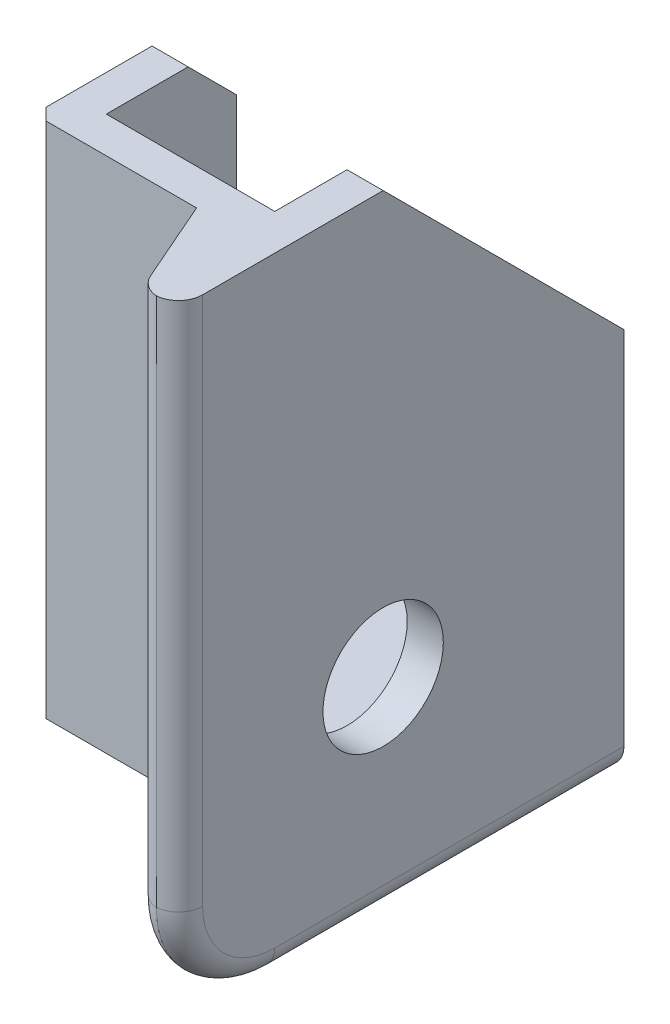
ISO-10303-21;
HEADER;
FILE_DESCRIPTION(('STEP AP214'),'2;1');
FILE_NAME('part.step','',(''),(''),'','','');
FILE_SCHEMA(('AUTOMOTIVE_DESIGN { 1 0 10303 214 1 1 1 1 }'));
ENDSEC;
DATA;
#1=APPLICATION_CONTEXT('core data for automotive mechanical design processes');
#2=APPLICATION_PROTOCOL_DEFINITION('international standard','automotive_design',2000,#1);
#3=PRODUCT_CONTEXT('',#1,'mechanical');
#4=PRODUCT('Part','Part','',(#3));
#5=PRODUCT_RELATED_PRODUCT_CATEGORY('part','',(#4));
#6=PRODUCT_DEFINITION_FORMATION('','',#4);
#7=PRODUCT_DEFINITION_CONTEXT('part definition',#1,'design');
#8=PRODUCT_DEFINITION('design','',#6,#7);
#9=PRODUCT_DEFINITION_SHAPE('','',#8);
#10=(LENGTH_UNIT() NAMED_UNIT(*) SI_UNIT(.MILLI.,.METRE.));
#11=(NAMED_UNIT(*) PLANE_ANGLE_UNIT() SI_UNIT($,.RADIAN.));
#12=(NAMED_UNIT(*) SI_UNIT($,.STERADIAN.) SOLID_ANGLE_UNIT());
#13=UNCERTAINTY_MEASURE_WITH_UNIT(LENGTH_MEASURE(1.E-05),#10,'distance_accuracy_value','');
#14=(GEOMETRIC_REPRESENTATION_CONTEXT(3) GLOBAL_UNCERTAINTY_ASSIGNED_CONTEXT((#13)) GLOBAL_UNIT_ASSIGNED_CONTEXT((#10,
#11,#12)) REPRESENTATION_CONTEXT('',''));
#15=CARTESIAN_POINT('',(0.,0.,0.));
#16=DIRECTION('',(0.,0.,1.));
#17=DIRECTION('',(1.,0.,0.));
#18=AXIS2_PLACEMENT_3D('',#15,#16,#17);
#19=CARTESIAN_POINT('',(0.,22.,0.));
#20=DIRECTION('',(0.,0.,1.));
#21=DIRECTION('',(-1.,0.,0.));
#22=AXIS2_PLACEMENT_3D('',#19,#20,#21);
#23=PLANE('',#22);
#24=DIRECTION('',(0.,1.,0.));
#25=VECTOR('',#24,1.);
#26=CARTESIAN_POINT('',(8.5,0.,0.));
#27=LINE('',#26,#25);
#28=CARTESIAN_POINT('',(8.5,1.5,0.));
#29=VERTEX_POINT('',#28);
#30=CARTESIAN_POINT('',(8.49999999999999,22.,0.));
#31=VERTEX_POINT('',#30);
#32=EDGE_CURVE('E223',#29,#31,#27,.T.);
#33=ORIENTED_EDGE('',*,*,#32,.F.);
#34=DIRECTION('',(1.,0.,0.));
#35=VECTOR('',#34,1.);
#36=CARTESIAN_POINT('',(0.,1.5,0.));
#37=LINE('',#36,#35);
#38=CARTESIAN_POINT('',(1.5,1.5,0.));
#39=VERTEX_POINT('',#38);
#40=EDGE_CURVE('E234',#39,#29,#37,.T.);
#41=ORIENTED_EDGE('',*,*,#40,.F.);
#42=DIRECTION('',(0.,-1.,0.));
#43=VECTOR('',#42,1.);
#44=CARTESIAN_POINT('',(1.5,0.,0.));
#45=LINE('',#44,#43);
#46=CARTESIAN_POINT('',(1.5,22.,0.));
#47=VERTEX_POINT('',#46);
#48=EDGE_CURVE('E225',#47,#39,#45,.T.);
#49=ORIENTED_EDGE('',*,*,#48,.F.);
#50=DIRECTION('',(1.,0.,0.));
#51=VECTOR('',#50,1.);
#52=CARTESIAN_POINT('',(0.,22.,0.));
#53=LINE('',#52,#51);
#54=EDGE_CURVE('E210',#47,#31,#53,.T.);
#55=ORIENTED_EDGE('',*,*,#54,.T.);
#56=EDGE_LOOP('',(#33,#41,#49,#55));
#57=FACE_BOUND('',#56,.T.);
#58=ADVANCED_FACE('F43',(#57),#23,.F.);
#59=CARTESIAN_POINT('',(0.,0.,-13.));
#60=DIRECTION('',(0.,-1.,0.));
#61=DIRECTION('',(0.,0.,1.));
#62=AXIS2_PLACEMENT_3D('',#59,#60,#61);
#63=PLANE('',#62);
#64=DIRECTION('',(0.,0.,1.));
#65=VECTOR('',#64,1.);
#66=CARTESIAN_POINT('',(0.50000000000001,0.,-13.));
#67=LINE('',#66,#65);
#68=CARTESIAN_POINT('',(0.50000000000001,0.,-13.));
#69=VERTEX_POINT('',#68);
#70=CARTESIAN_POINT('',(0.50000000000001,0.,0.999999999999992));
#71=VERTEX_POINT('',#70);
#72=EDGE_CURVE('E340',#69,#71,#67,.T.);
#73=ORIENTED_EDGE('',*,*,#72,.F.);
#74=DIRECTION('',(-1.,0.,0.));
#75=VECTOR('',#74,1.);
#76=CARTESIAN_POINT('',(0.,0.,-13.));
#77=LINE('',#76,#75);
#78=CARTESIAN_POINT('',(6.75,0.,-13.));
#79=VERTEX_POINT('',#78);
#80=EDGE_CURVE('E403',#79,#69,#77,.T.);
#81=ORIENTED_EDGE('',*,*,#80,.F.);
#82=DIRECTION('',(0.,0.,1.));
#83=VECTOR('',#82,1.);
#84=CARTESIAN_POINT('',(6.75,0.,-13.));
#85=LINE('',#84,#83);
#86=CARTESIAN_POINT('',(6.75,0.,0.999999999999989));
#87=VERTEX_POINT('',#86);
#88=EDGE_CURVE('E244',#79,#87,#85,.T.);
#89=ORIENTED_EDGE('',*,*,#88,.T.);
#90=DIRECTION('',(1.,0.,0.));
#91=VECTOR('',#90,1.);
#92=CARTESIAN_POINT('',(0.,0.,0.999999999999992));
#93=LINE('',#92,#91);
#94=EDGE_CURVE('E342',#71,#87,#93,.T.);
#95=ORIENTED_EDGE('',*,*,#94,.F.);
#96=EDGE_LOOP('',(#73,#81,#89,#95));
#97=FACE_BOUND('',#96,.T.);
#98=ADVANCED_FACE('F418',(#97),#63,.T.);
#99=CARTESIAN_POINT('',(9.99999999999999,0.,-13.));
#100=DIRECTION('',(1.,0.,0.));
#101=DIRECTION('',(0.,0.,1.));
#102=AXIS2_PLACEMENT_3D('',#99,#100,#101);
#103=PLANE('',#102);
#104=CARTESIAN_POINT('',(10.,4.5,-3.));
#105=DIRECTION('',(1.,0.,0.));
#106=DIRECTION('',(0.,0.,-1.));
#107=AXIS2_PLACEMENT_3D('',#104,#105,#106);
#108=CIRCLE('',#107,2.5);
#109=CARTESIAN_POINT('',(10.,4.5,-5.50000000000001));
#110=VERTEX_POINT('',#109);
#111=EDGE_CURVE('E469',#110,#110,#108,.T.);
#112=ORIENTED_EDGE('',*,*,#111,.F.);
#113=EDGE_LOOP('',(#112));
#114=FACE_BOUND('',#113,.T.);
#115=DIRECTION('',(0.,0.,1.));
#116=VECTOR('',#115,1.);
#117=CARTESIAN_POINT('',(10.,22.,0.));
#118=LINE('',#117,#116);
#119=CARTESIAN_POINT('',(10.,22.,-2.99999999999996));
#120=VERTEX_POINT('',#119);
#121=CARTESIAN_POINT('',(9.99999999999999,22.,4.5));
#122=VERTEX_POINT('',#121);
#123=EDGE_CURVE('E227',#120,#122,#118,.T.);
#124=ORIENTED_EDGE('',*,*,#123,.T.);
#125=DIRECTION('',(0.,-1.,0.));
#126=VECTOR('',#125,1.);
#127=CARTESIAN_POINT('',(9.99999999999999,22.,4.5));
#128=LINE('',#127,#126);
#129=CARTESIAN_POINT('',(9.99999999999999,0.,4.5));
#130=VERTEX_POINT('',#129);
#131=EDGE_CURVE('E273',#130,#122,#128,.F.);
#132=ORIENTED_EDGE('',*,*,#131,.F.);
#133=CARTESIAN_POINT('',(9.99999999999999,0.,1.5));
#134=DIRECTION('',(-1.,0.,0.));
#135=DIRECTION('',(0.,0.,1.));
#136=AXIS2_PLACEMENT_3D('',#133,#134,#135);
#137=CIRCLE('',#136,3.);
#138=CARTESIAN_POINT('',(9.99999999999999,-3.,1.5));
#139=VERTEX_POINT('',#138);
#140=EDGE_CURVE('E270',#139,#130,#137,.T.);
#141=ORIENTED_EDGE('',*,*,#140,.F.);
#142=DIRECTION('',(0.,0.,1.));
#143=VECTOR('',#142,1.);
#144=CARTESIAN_POINT('',(9.99999999999999,-3.,-13.));
#145=LINE('',#144,#143);
#146=CARTESIAN_POINT('',(9.99999999999999,-3.,-13.));
#147=VERTEX_POINT('',#146);
#148=EDGE_CURVE('E267',#147,#139,#145,.T.);
#149=ORIENTED_EDGE('',*,*,#148,.F.);
#150=DIRECTION('',(0.,-1.,0.));
#151=VECTOR('',#150,1.);
#152=CARTESIAN_POINT('',(9.99999999999999,0.,-13.));
#153=LINE('',#152,#151);
#154=CARTESIAN_POINT('',(9.99999999999999,12.,-13.));
#155=VERTEX_POINT('',#154);
#156=EDGE_CURVE('E243',#155,#147,#153,.T.);
#157=ORIENTED_EDGE('',*,*,#156,.F.);
#158=DIRECTION('',(0.,-0.707106781186546,-0.707106781186549));
#159=VECTOR('',#158,1.);
#160=CARTESIAN_POINT('',(9.99999999999999,6.00000000000001,-19.));
#161=LINE('',#160,#159);
#162=EDGE_CURVE('E307',#120,#155,#161,.T.);
#163=ORIENTED_EDGE('',*,*,#162,.F.);
#164=EDGE_LOOP('',(#124,#132,#141,#149,#157,#163));
#165=FACE_BOUND('',#164,.T.);
#166=ADVANCED_FACE('F444',(#114,#165),#103,.T.);
#167=CARTESIAN_POINT('',(8.5,0.,-13.));
#168=DIRECTION('',(-1.,0.,0.));
#169=DIRECTION('',(0.,-1.,0.));
#170=AXIS2_PLACEMENT_3D('',#167,#168,#169);
#171=PLANE('',#170);
#172=CARTESIAN_POINT('',(8.5,4.5,-3.));
#173=DIRECTION('',(1.,0.,0.));
#174=DIRECTION('',(0.,-1.,0.));
#175=AXIS2_PLACEMENT_3D('',#172,#173,#174);
#176=CIRCLE('',#175,2.5);
#177=CARTESIAN_POINT('',(8.49999999999999,4.5,-5.50000000000001));
#178=VERTEX_POINT('',#177);
#179=EDGE_CURVE('E364',#178,#178,#176,.T.);
#180=ORIENTED_EDGE('',*,*,#179,.T.);
#181=EDGE_LOOP('',(#180));
#182=FACE_BOUND('',#181,.T.);
#183=DIRECTION('',(0.,1.,0.));
#184=VECTOR('',#183,1.);
#185=CARTESIAN_POINT('',(8.5,0.,-13.));
#186=LINE('',#185,#184);
#187=CARTESIAN_POINT('',(8.5,1.5,-13.));
#188=VERTEX_POINT('',#187);
#189=CARTESIAN_POINT('',(8.49999999999999,12.,-13.));
#190=VERTEX_POINT('',#189);
#191=EDGE_CURVE('E394',#188,#190,#186,.T.);
#192=ORIENTED_EDGE('',*,*,#191,.F.);
#193=DIRECTION('',(0.,0.,1.));
#194=VECTOR('',#193,1.);
#195=CARTESIAN_POINT('',(8.5,1.5,-13.));
#196=LINE('',#195,#194);
#197=EDGE_CURVE('E232',#188,#29,#196,.T.);
#198=ORIENTED_EDGE('',*,*,#197,.T.);
#199=ORIENTED_EDGE('',*,*,#32,.T.);
#200=DIRECTION('',(0.,0.,1.));
#201=VECTOR('',#200,1.);
#202=CARTESIAN_POINT('',(8.49999999999999,22.,0.));
#203=LINE('',#202,#201);
#204=CARTESIAN_POINT('',(8.49999999999999,22.,-2.99999999999996));
#205=VERTEX_POINT('',#204);
#206=EDGE_CURVE('E206',#205,#31,#203,.T.);
#207=ORIENTED_EDGE('',*,*,#206,.F.);
#208=DIRECTION('',(0.,0.707106781186546,0.707106781186549));
#209=VECTOR('',#208,1.);
#210=CARTESIAN_POINT('',(8.5,6.00000000000001,-19.));
#211=LINE('',#210,#209);
#212=EDGE_CURVE('E304',#190,#205,#211,.T.);
#213=ORIENTED_EDGE('',*,*,#212,.F.);
#214=EDGE_LOOP('',(#192,#198,#199,#207,#213));
#215=FACE_BOUND('',#214,.T.);
#216=ADVANCED_FACE('F230',(#182,#215),#171,.T.);
#217=CARTESIAN_POINT('',(0.,1.5,-13.));
#218=DIRECTION('',(0.,1.,0.));
#219=DIRECTION('',(-1.,0.,0.));
#220=AXIS2_PLACEMENT_3D('',#217,#218,#219);
#221=PLANE('',#220);
#222=ORIENTED_EDGE('',*,*,#40,.T.);
#223=ORIENTED_EDGE('',*,*,#197,.F.);
#224=DIRECTION('',(1.,0.,0.));
#225=VECTOR('',#224,1.);
#226=CARTESIAN_POINT('',(0.,1.5,-13.));
#227=LINE('',#226,#225);
#228=CARTESIAN_POINT('',(1.5,1.5,-13.));
#229=VERTEX_POINT('',#228);
#230=EDGE_CURVE('E397',#229,#188,#227,.T.);
#231=ORIENTED_EDGE('',*,*,#230,.F.);
#232=DIRECTION('',(0.,0.,1.));
#233=VECTOR('',#232,1.);
#234=CARTESIAN_POINT('',(1.5,1.5,-13.));
#235=LINE('',#234,#233);
#236=EDGE_CURVE('E253',#229,#39,#235,.T.);
#237=ORIENTED_EDGE('',*,*,#236,.T.);
#238=EDGE_LOOP('',(#222,#223,#231,#237));
#239=FACE_BOUND('',#238,.T.);
#240=ADVANCED_FACE('F436',(#239),#221,.T.);
#241=CARTESIAN_POINT('',(1.5,0.,-13.));
#242=DIRECTION('',(1.,0.,0.));
#243=DIRECTION('',(0.,1.,0.));
#244=AXIS2_PLACEMENT_3D('',#241,#242,#243);
#245=PLANE('',#244);
#246=CARTESIAN_POINT('',(1.5,4.5,-3.));
#247=DIRECTION('',(-1.,0.,0.));
#248=DIRECTION('',(0.,1.,0.));
#249=AXIS2_PLACEMENT_3D('',#246,#247,#248);
#250=CIRCLE('',#249,2.5);
#251=CARTESIAN_POINT('',(1.5,4.5,-5.50000000000001));
#252=VERTEX_POINT('',#251);
#253=EDGE_CURVE('E466',#252,#252,#250,.T.);
#254=ORIENTED_EDGE('',*,*,#253,.T.);
#255=EDGE_LOOP('',(#254));
#256=FACE_BOUND('',#255,.T.);
#257=DIRECTION('',(0.,0.,1.));
#258=VECTOR('',#257,1.);
#259=CARTESIAN_POINT('',(1.5,22.,-5.4));
#260=LINE('',#259,#258);
#261=CARTESIAN_POINT('',(1.5,22.,-3.39999999999999));
#262=VERTEX_POINT('',#261);
#263=EDGE_CURVE('E288',#262,#47,#260,.T.);
#264=ORIENTED_EDGE('',*,*,#263,.T.);
#265=ORIENTED_EDGE('',*,*,#48,.T.);
#266=ORIENTED_EDGE('',*,*,#236,.F.);
#267=DIRECTION('',(0.,-1.,0.));
#268=VECTOR('',#267,1.);
#269=CARTESIAN_POINT('',(1.5,0.,-13.));
#270=LINE('',#269,#268);
#271=CARTESIAN_POINT('',(1.5,4.9,-13.));
#272=VERTEX_POINT('',#271);
#273=EDGE_CURVE('E399',#272,#229,#270,.T.);
#274=ORIENTED_EDGE('',*,*,#273,.F.);
#275=DIRECTION('',(0.,0.707106781186549,0.707106781186546));
#276=VECTOR('',#275,1.);
#277=CARTESIAN_POINT('',(1.5,2.44999999999999,-15.45));
#278=LINE('',#277,#276);
#279=CARTESIAN_POINT('',(1.5,6.9,-11.));
#280=VERTEX_POINT('',#279);
#281=EDGE_CURVE('E321',#280,#272,#278,.F.);
#282=ORIENTED_EDGE('',*,*,#281,.F.);
#283=DIRECTION('',(0.,0.,1.));
#284=VECTOR('',#283,1.);
#285=CARTESIAN_POINT('',(1.5,6.9,-13.));
#286=LINE('',#285,#284);
#287=CARTESIAN_POINT('',(1.5,6.9,-7.39999999999999));
#288=VERTEX_POINT('',#287);
#289=EDGE_CURVE('E250',#280,#288,#286,.T.);
#290=ORIENTED_EDGE('',*,*,#289,.T.);
#291=DIRECTION('',(0.,0.707106781186551,0.707106781186544));
#292=VECTOR('',#291,1.);
#293=CARTESIAN_POINT('',(1.5,8.90000000000001,-5.4));
#294=LINE('',#293,#292);
#295=CARTESIAN_POINT('',(1.5,8.90000000000001,-5.4));
#296=VERTEX_POINT('',#295);
#297=EDGE_CURVE('E334',#296,#288,#294,.F.);
#298=ORIENTED_EDGE('',*,*,#297,.F.);
#299=DIRECTION('',(0.,1.,0.));
#300=VECTOR('',#299,1.);
#301=CARTESIAN_POINT('',(1.5,0.,-5.4));
#302=LINE('',#301,#300);
#303=CARTESIAN_POINT('',(1.5,20.,-5.4));
#304=VERTEX_POINT('',#303);
#305=EDGE_CURVE('E218',#296,#304,#302,.T.);
#306=ORIENTED_EDGE('',*,*,#305,.T.);
#307=DIRECTION('',(0.,-0.707106781186547,-0.707106781186548));
#308=VECTOR('',#307,1.);
#309=CARTESIAN_POINT('',(1.5,6.20000000000001,-19.2));
#310=LINE('',#309,#308);
#311=EDGE_CURVE('E324',#262,#304,#310,.T.);
#312=ORIENTED_EDGE('',*,*,#311,.F.);
#313=EDGE_LOOP('',(#264,#265,#266,#274,#282,#290,#298,#306,#312));
#314=FACE_BOUND('',#313,.T.);
#315=ADVANCED_FACE('F433',(#256,#314),#245,.T.);
#316=CARTESIAN_POINT('',(0.,6.9,-13.));
#317=DIRECTION('',(0.,1.,0.));
#318=DIRECTION('',(-1.,0.,0.));
#319=AXIS2_PLACEMENT_3D('',#316,#317,#318);
#320=PLANE('',#319);
#321=ORIENTED_EDGE('',*,*,#289,.F.);
#322=DIRECTION('',(1.,0.,0.));
#323=VECTOR('',#322,1.);
#324=CARTESIAN_POINT('',(0.,6.9,-11.));
#325=LINE('',#324,#323);
#326=CARTESIAN_POINT('',(0.,6.9,-11.));
#327=VERTEX_POINT('',#326);
#328=EDGE_CURVE('E327',#327,#280,#325,.T.);
#329=ORIENTED_EDGE('',*,*,#328,.F.);
#330=DIRECTION('',(0.,0.,1.));
#331=VECTOR('',#330,1.);
#332=CARTESIAN_POINT('',(0.,6.9,-13.));
#333=LINE('',#332,#331);
#334=CARTESIAN_POINT('',(0.,6.9,-7.39999999999999));
#335=VERTEX_POINT('',#334);
#336=EDGE_CURVE('E247',#327,#335,#333,.T.);
#337=ORIENTED_EDGE('',*,*,#336,.T.);
#338=DIRECTION('',(-1.,0.,0.));
#339=VECTOR('',#338,1.);
#340=CARTESIAN_POINT('',(0.,6.9,-7.39999999999999));
#341=LINE('',#340,#339);
#342=EDGE_CURVE('E329',#288,#335,#341,.T.);
#343=ORIENTED_EDGE('',*,*,#342,.F.);
#344=EDGE_LOOP('',(#321,#329,#337,#343));
#345=FACE_BOUND('',#344,.T.);
#346=ADVANCED_FACE('F506',(#345),#320,.T.);
#347=CARTESIAN_POINT('',(0.,0.,-13.));
#348=DIRECTION('',(-1.,0.,0.));
#349=DIRECTION('',(0.,0.,-1.));
#350=AXIS2_PLACEMENT_3D('',#347,#348,#349);
#351=PLANE('',#350);
#352=CARTESIAN_POINT('',(0.,4.5,-3.));
#353=DIRECTION('',(1.,0.,0.));
#354=DIRECTION('',(0.,0.,-1.));
#355=AXIS2_PLACEMENT_3D('',#352,#353,#354);
#356=CIRCLE('',#355,2.5);
#357=CARTESIAN_POINT('',(0.,4.5,-5.50000000000001));
#358=VERTEX_POINT('',#357);
#359=EDGE_CURVE('E470',#358,#358,#356,.T.);
#360=ORIENTED_EDGE('',*,*,#359,.T.);
#361=EDGE_LOOP('',(#360));
#362=FACE_BOUND('',#361,.T.);
#363=DIRECTION('',(0.,-1.,0.));
#364=VECTOR('',#363,1.);
#365=CARTESIAN_POINT('',(0.,0.,0.999999999999992));
#366=LINE('',#365,#364);
#367=CARTESIAN_POINT('',(0.,22.,0.999999999999992));
#368=VERTEX_POINT('',#367);
#369=CARTESIAN_POINT('',(0.,0.500000000000007,0.999999999999992));
#370=VERTEX_POINT('',#369);
#371=EDGE_CURVE('E351',#368,#370,#366,.T.);
#372=ORIENTED_EDGE('',*,*,#371,.F.);
#373=DIRECTION('',(0.,0.,1.));
#374=VECTOR('',#373,1.);
#375=CARTESIAN_POINT('',(0.,22.,0.));
#376=LINE('',#375,#374);
#377=CARTESIAN_POINT('',(0.,22.,-3.39999999999999));
#378=VERTEX_POINT('',#377);
#379=EDGE_CURVE('E381',#378,#368,#376,.T.);
#380=ORIENTED_EDGE('',*,*,#379,.F.);
#381=DIRECTION('',(0.,0.707106781186547,0.707106781186548));
#382=VECTOR('',#381,1.);
#383=CARTESIAN_POINT('',(0.,6.20000000000001,-19.2));
#384=LINE('',#383,#382);
#385=CARTESIAN_POINT('',(0.,20.,-5.4));
#386=VERTEX_POINT('',#385);
#387=EDGE_CURVE('E316',#386,#378,#384,.T.);
#388=ORIENTED_EDGE('',*,*,#387,.F.);
#389=DIRECTION('',(0.,-1.,0.));
#390=VECTOR('',#389,1.);
#391=CARTESIAN_POINT('',(0.,0.,-5.4));
#392=LINE('',#391,#390);
#393=CARTESIAN_POINT('',(0.,8.90000000000001,-5.4));
#394=VERTEX_POINT('',#393);
#395=EDGE_CURVE('E459',#386,#394,#392,.T.);
#396=ORIENTED_EDGE('',*,*,#395,.T.);
#397=DIRECTION('',(0.,-0.707106781186551,-0.707106781186544));
#398=VECTOR('',#397,1.);
#399=CARTESIAN_POINT('',(0.,8.90000000000001,-5.4));
#400=LINE('',#399,#398);
#401=EDGE_CURVE('E337',#335,#394,#400,.F.);
#402=ORIENTED_EDGE('',*,*,#401,.F.);
#403=ORIENTED_EDGE('',*,*,#336,.F.);
#404=DIRECTION('',(0.,-0.707106781186549,-0.707106781186546));
#405=VECTOR('',#404,1.);
#406=CARTESIAN_POINT('',(0.,2.44999999999999,-15.45));
#407=LINE('',#406,#405);
#408=CARTESIAN_POINT('',(0.,4.9,-13.));
#409=VERTEX_POINT('',#408);
#410=EDGE_CURVE('E314',#409,#327,#407,.F.);
#411=ORIENTED_EDGE('',*,*,#410,.F.);
#412=DIRECTION('',(0.,1.,0.));
#413=VECTOR('',#412,1.);
#414=CARTESIAN_POINT('',(0.,0.,-13.));
#415=LINE('',#414,#413);
#416=CARTESIAN_POINT('',(0.,0.500000000000007,-13.));
#417=VERTEX_POINT('',#416);
#418=EDGE_CURVE('E401',#417,#409,#415,.T.);
#419=ORIENTED_EDGE('',*,*,#418,.F.);
#420=DIRECTION('',(0.,0.,-1.));
#421=VECTOR('',#420,1.);
#422=CARTESIAN_POINT('',(0.,0.500000000000007,-13.));
#423=LINE('',#422,#421);
#424=EDGE_CURVE('E354',#370,#417,#423,.T.);
#425=ORIENTED_EDGE('',*,*,#424,.F.);
#426=EDGE_LOOP('',(#372,#380,#388,#396,#402,#403,#411,#419,#425));
#427=FACE_BOUND('',#426,.T.);
#428=ADVANCED_FACE('F424',(#362,#427),#351,.T.);
#429=CARTESIAN_POINT('',(5.6655737704918,2.47868852459017,-13.));
#430=DIRECTION('',(-0.916157334902189,-0.400818834019708,0.));
#431=DIRECTION('',(0.400818834019708,-0.916157334902189,0.));
#432=AXIS2_PLACEMENT_3D('',#429,#430,#431);
#433=PLANE('',#432);
#434=DIRECTION('',(-0.400818834019709,0.916157334902189,0.));
#435=VECTOR('',#434,1.);
#436=CARTESIAN_POINT('',(8.5,-4.00000000000001,1.5));
#437=LINE('',#436,#435);
#438=CARTESIAN_POINT('',(8.23785823988363,-3.40081883401971,1.5));
#439=VERTEX_POINT('',#438);
#440=CARTESIAN_POINT('',(6.75,0.,1.5));
#441=VERTEX_POINT('',#440);
#442=EDGE_CURVE('E302',#439,#441,#437,.T.);
#443=ORIENTED_EDGE('',*,*,#442,.T.);
#444=DIRECTION('',(-0.295540231644525,0.675520529473199,-0.675520529473198));
#445=VECTOR('',#444,1.);
#446=CARTESIAN_POINT('',(3.26559714795008,7.96434937611408,-6.46434937611407));
#447=LINE('',#446,#445);
#448=CARTESIAN_POINT('',(6.640625,0.250000000000005,1.25));
#449=VERTEX_POINT('',#448);
#450=EDGE_CURVE('E11',#441,#449,#447,.T.);
#451=ORIENTED_EDGE('',*,*,#450,.T.);
#452=DIRECTION('',(0.295540231644526,-0.6755205294732,-0.675520529473196));
#453=VECTOR('',#452,1.);
#454=CARTESIAN_POINT('',(6.16042780748662,1.34759358288771,2.34759358288769));
#455=LINE('',#454,#453);
#456=EDGE_CURVE('E360',#87,#449,#455,.F.);
#457=ORIENTED_EDGE('',*,*,#456,.F.);
#458=ORIENTED_EDGE('',*,*,#88,.F.);
#459=DIRECTION('',(-0.400818834019708,0.916157334902189,0.));
#460=VECTOR('',#459,1.);
#461=CARTESIAN_POINT('',(5.6655737704918,2.47868852459017,-13.));
#462=LINE('',#461,#460);
#463=CARTESIAN_POINT('',(8.23785823988363,-3.40081883401971,-13.));
#464=VERTEX_POINT('',#463);
#465=EDGE_CURVE('E239',#464,#79,#462,.T.);
#466=ORIENTED_EDGE('',*,*,#465,.F.);
#467=DIRECTION('',(0.,0.,1.));
#468=VECTOR('',#467,1.);
#469=CARTESIAN_POINT('',(8.23785823988363,-3.40081883401971,-13.));
#470=LINE('',#469,#468);
#471=EDGE_CURVE('E276',#439,#464,#470,.F.);
#472=ORIENTED_EDGE('',*,*,#471,.F.);
#473=EDGE_LOOP('',(#443,#451,#457,#458,#466,#472));
#474=FACE_BOUND('',#473,.T.);
#475=ADVANCED_FACE('F415',(#474),#433,.T.);
#476=CARTESIAN_POINT('',(0.,0.,-13.));
#477=DIRECTION('',(0.,0.,-1.));
#478=DIRECTION('',(1.,0.,0.));
#479=AXIS2_PLACEMENT_3D('',#476,#477,#478);
#480=PLANE('',#479);
#481=ORIENTED_EDGE('',*,*,#418,.T.);
#482=DIRECTION('',(-1.,0.,0.));
#483=VECTOR('',#482,1.);
#484=CARTESIAN_POINT('',(0.,4.9,-13.));
#485=LINE('',#484,#483);
#486=EDGE_CURVE('E332',#272,#409,#485,.T.);
#487=ORIENTED_EDGE('',*,*,#486,.F.);
#488=ORIENTED_EDGE('',*,*,#273,.T.);
#489=ORIENTED_EDGE('',*,*,#230,.T.);
#490=ORIENTED_EDGE('',*,*,#191,.T.);
#491=DIRECTION('',(-1.,0.,0.));
#492=VECTOR('',#491,1.);
#493=CARTESIAN_POINT('',(8.49999999999999,12.,-13.));
#494=LINE('',#493,#492);
#495=EDGE_CURVE('E284',#155,#190,#494,.T.);
#496=ORIENTED_EDGE('',*,*,#495,.F.);
#497=ORIENTED_EDGE('',*,*,#156,.T.);
#498=CARTESIAN_POINT('',(8.99999999999999,-3.,-13.));
#499=DIRECTION('',(0.,0.,1.));
#500=DIRECTION('',(1.,0.,0.));
#501=AXIS2_PLACEMENT_3D('',#498,#499,#500);
#502=CIRCLE('',#501,1.);
#503=CARTESIAN_POINT('',(9.0770077873929,-3.99703049134962,-13.));
#504=VERTEX_POINT('',#503);
#505=EDGE_CURVE('E279',#504,#147,#502,.T.);
#506=ORIENTED_EDGE('',*,*,#505,.F.);
#507=CARTESIAN_POINT('',(9.15401557478581,-3.,-13.));
#508=DIRECTION('',(0.,0.,1.));
#509=DIRECTION('',(1.,0.,0.));
#510=AXIS2_PLACEMENT_3D('',#507,#508,#509);
#511=CIRCLE('',#510,1.);
#512=EDGE_CURVE('E281',#464,#504,#511,.T.);
#513=ORIENTED_EDGE('',*,*,#512,.F.);
#514=ORIENTED_EDGE('',*,*,#465,.T.);
#515=ORIENTED_EDGE('',*,*,#80,.T.);
#516=DIRECTION('',(-0.70710678118655,0.707106781186545,0.));
#517=VECTOR('',#516,1.);
#518=CARTESIAN_POINT('',(0.250000000000003,0.250000000000005,-13.));
#519=LINE('',#518,#517);
#520=EDGE_CURVE('E356',#417,#69,#519,.F.);
#521=ORIENTED_EDGE('',*,*,#520,.F.);
#522=EDGE_LOOP('',(#481,#487,#488,#489,#490,#496,#497,#506,#513,#514,#515,#521));
#523=FACE_BOUND('',#522,.T.);
#524=ADVANCED_FACE('F410',(#523),#480,.T.);
#525=CARTESIAN_POINT('',(5.11475409836065,22.,-2.23770491803279));
#526=DIRECTION('',(0.916157334902189,0.,-0.400818834019709));
#527=DIRECTION('',(0.400818834019709,0.,0.916157334902189));
#528=AXIS2_PLACEMENT_3D('',#525,#526,#527);
#529=PLANE('',#528);
#530=DIRECTION('',(-0.400818834019709,0.,-0.916157334902189));
#531=VECTOR('',#530,1.);
#532=CARTESIAN_POINT('',(5.11475409836065,22.,-2.23770491803279));
#533=LINE('',#532,#531);
#534=CARTESIAN_POINT('',(8.23785823988363,22.,4.90081883401971));
#535=VERTEX_POINT('',#534);
#536=CARTESIAN_POINT('',(6.75,22.,1.5));
#537=VERTEX_POINT('',#536);
#538=EDGE_CURVE('E380',#535,#537,#533,.T.);
#539=ORIENTED_EDGE('',*,*,#538,.T.);
#540=DIRECTION('',(0.,-1.,0.));
#541=VECTOR('',#540,1.);
#542=CARTESIAN_POINT('',(6.75,22.,1.5));
#543=LINE('',#542,#541);
#544=CARTESIAN_POINT('',(6.75,0.500000000000011,1.5));
#545=VERTEX_POINT('',#544);
#546=EDGE_CURVE('E226',#537,#545,#543,.T.);
#547=ORIENTED_EDGE('',*,*,#546,.T.);
#548=DIRECTION('',(-0.295540231644524,-0.675520529473201,-0.675520529473197));
#549=VECTOR('',#548,1.);
#550=CARTESIAN_POINT('',(10.1532976827095,8.27896613190737,9.27896613190731));
#551=LINE('',#550,#549);
#552=EDGE_CURVE('E52',#449,#545,#551,.F.);
#553=ORIENTED_EDGE('',*,*,#552,.F.);
#554=ORIENTED_EDGE('',*,*,#450,.F.);
#555=DIRECTION('',(-0.400818834019709,0.,-0.916157334902189));
#556=VECTOR('',#555,1.);
#557=CARTESIAN_POINT('',(5.11475409836065,0.,-2.23770491803279));
#558=LINE('',#557,#556);
#559=CARTESIAN_POINT('',(8.23785823988363,0.,4.90081883401971));
#560=VERTEX_POINT('',#559);
#561=EDGE_CURVE('E385',#560,#441,#558,.T.);
#562=ORIENTED_EDGE('',*,*,#561,.F.);
#563=DIRECTION('',(0.,-1.,0.));
#564=VECTOR('',#563,1.);
#565=CARTESIAN_POINT('',(8.23785823988363,22.,4.90081883401971));
#566=LINE('',#565,#564);
#567=EDGE_CURVE('E256',#535,#560,#566,.T.);
#568=ORIENTED_EDGE('',*,*,#567,.F.);
#569=EDGE_LOOP('',(#539,#547,#553,#554,#562,#568));
#570=FACE_BOUND('',#569,.T.);
#571=ADVANCED_FACE('F495',(#570),#529,.F.);
#572=CARTESIAN_POINT('',(0.,22.,1.5));
#573=DIRECTION('',(0.,0.,1.));
#574=DIRECTION('',(-1.,0.,0.));
#575=AXIS2_PLACEMENT_3D('',#572,#573,#574);
#576=PLANE('',#575);
#577=ORIENTED_EDGE('',*,*,#546,.F.);
#578=DIRECTION('',(1.,0.,0.));
#579=VECTOR('',#578,1.);
#580=CARTESIAN_POINT('',(0.,22.,1.5));
#581=LINE('',#580,#579);
#582=CARTESIAN_POINT('',(0.500000000000011,22.,1.5));
#583=VERTEX_POINT('',#582);
#584=EDGE_CURVE('E377',#583,#537,#581,.T.);
#585=ORIENTED_EDGE('',*,*,#584,.F.);
#586=DIRECTION('',(0.,1.,0.));
#587=VECTOR('',#586,1.);
#588=CARTESIAN_POINT('',(0.500000000000011,22.,1.5));
#589=LINE('',#588,#587);
#590=CARTESIAN_POINT('',(0.500000000000011,0.500000000000011,1.5));
#591=VERTEX_POINT('',#590);
#592=EDGE_CURVE('E345',#591,#583,#589,.T.);
#593=ORIENTED_EDGE('',*,*,#592,.F.);
#594=DIRECTION('',(-1.,0.,0.));
#595=VECTOR('',#594,1.);
#596=CARTESIAN_POINT('',(0.,0.500000000000011,1.5));
#597=LINE('',#596,#595);
#598=EDGE_CURVE('E348',#545,#591,#597,.T.);
#599=ORIENTED_EDGE('',*,*,#598,.F.);
#600=EDGE_LOOP('',(#577,#585,#593,#599));
#601=FACE_BOUND('',#600,.T.);
#602=ADVANCED_FACE('F376',(#601),#576,.T.);
#603=CARTESIAN_POINT('',(0.,22.,0.));
#604=DIRECTION('',(0.,-1.,0.));
#605=DIRECTION('',(0.,0.,1.));
#606=AXIS2_PLACEMENT_3D('',#603,#604,#605);
#607=PLANE('',#606);
#608=ORIENTED_EDGE('',*,*,#584,.T.);
#609=ORIENTED_EDGE('',*,*,#538,.F.);
#610=CARTESIAN_POINT('',(9.15401557478581,22.,4.5));
#611=DIRECTION('',(0.,1.,0.));
#612=DIRECTION('',(0.,0.,1.));
#613=AXIS2_PLACEMENT_3D('',#610,#611,#612);
#614=CIRCLE('',#613,1.);
#615=CARTESIAN_POINT('',(9.0770077873929,22.,5.49703049134961));
#616=VERTEX_POINT('',#615);
#617=EDGE_CURVE('E262',#616,#535,#614,.F.);
#618=ORIENTED_EDGE('',*,*,#617,.F.);
#619=CARTESIAN_POINT('',(8.99999999999999,22.,4.5));
#620=DIRECTION('',(0.,1.,0.));
#621=DIRECTION('',(0.,0.,1.));
#622=AXIS2_PLACEMENT_3D('',#619,#620,#621);
#623=CIRCLE('',#622,1.);
#624=EDGE_CURVE('E259',#122,#616,#623,.F.);
#625=ORIENTED_EDGE('',*,*,#624,.F.);
#626=ORIENTED_EDGE('',*,*,#123,.F.);
#627=DIRECTION('',(1.,0.,0.));
#628=VECTOR('',#627,1.);
#629=CARTESIAN_POINT('',(9.99999999999999,22.,-2.99999999999996));
#630=LINE('',#629,#628);
#631=EDGE_CURVE('E213',#205,#120,#630,.T.);
#632=ORIENTED_EDGE('',*,*,#631,.F.);
#633=ORIENTED_EDGE('',*,*,#206,.T.);
#634=ORIENTED_EDGE('',*,*,#54,.F.);
#635=ORIENTED_EDGE('',*,*,#263,.F.);
#636=DIRECTION('',(1.,0.,0.));
#637=VECTOR('',#636,1.);
#638=CARTESIAN_POINT('',(1.5,22.,-3.39999999999999));
#639=LINE('',#638,#637);
#640=EDGE_CURVE('E319',#378,#262,#639,.T.);
#641=ORIENTED_EDGE('',*,*,#640,.F.);
#642=ORIENTED_EDGE('',*,*,#379,.T.);
#643=DIRECTION('',(0.707106781186549,0.,0.707106781186546));
#644=VECTOR('',#643,1.);
#645=CARTESIAN_POINT('',(0.,22.,0.999999999999992));
#646=LINE('',#645,#644);
#647=EDGE_CURVE('E358',#583,#368,#646,.F.);
#648=ORIENTED_EDGE('',*,*,#647,.F.);
#649=EDGE_LOOP('',(#608,#609,#618,#625,#626,#632,#633,#634,#635,#641,#642,#648));
#650=FACE_BOUND('',#649,.T.);
#651=ADVANCED_FACE('F208',(#650),#607,.F.);
#652=CARTESIAN_POINT('',(8.5,0.,1.5));
#653=DIRECTION('',(1.,0.,0.));
#654=DIRECTION('',(0.,1.,0.));
#655=AXIS2_PLACEMENT_3D('',#652,#653,#654);
#656=CONICAL_SURFACE('',#655,4.00000000000001,1.15838588519751);
#657=ORIENTED_EDGE('',*,*,#561,.T.);
#658=ORIENTED_EDGE('',*,*,#442,.F.);
#659=CARTESIAN_POINT('',(8.23785823988362,0.,1.5));
#660=DIRECTION('',(1.,0.,0.));
#661=DIRECTION('',(0.,-1.,0.));
#662=AXIS2_PLACEMENT_3D('',#659,#660,#661);
#663=CIRCLE('',#662,3.40081883401971);
#664=EDGE_CURVE('E264',#560,#439,#663,.T.);
#665=ORIENTED_EDGE('',*,*,#664,.F.);
#666=EDGE_LOOP('',(#657,#658,#665));
#667=FACE_BOUND('',#666,.T.);
#668=ADVANCED_FACE('F455',(#667),#656,.T.);
#669=CARTESIAN_POINT('',(8.99999999999999,-3.,-13.));
#670=DIRECTION('',(0.,0.,1.));
#671=DIRECTION('',(-1.,0.,0.));
#672=AXIS2_PLACEMENT_3D('',#669,#670,#671);
#673=CYLINDRICAL_SURFACE('',#672,1.);
#674=ORIENTED_EDGE('',*,*,#148,.T.);
#675=CARTESIAN_POINT('',(8.99999999999999,-3.,1.5));
#676=DIRECTION('',(0.,0.,-1.));
#677=DIRECTION('',(-1.,0.,0.));
#678=AXIS2_PLACEMENT_3D('',#675,#676,#677);
#679=CIRCLE('',#678,1.);
#680=CARTESIAN_POINT('',(9.0770077873929,-3.99703049134962,1.5));
#681=VERTEX_POINT('',#680);
#682=EDGE_CURVE('E297',#139,#681,#679,.T.);
#683=ORIENTED_EDGE('',*,*,#682,.T.);
#684=DIRECTION('',(0.,0.,1.));
#685=VECTOR('',#684,1.);
#686=CARTESIAN_POINT('',(9.0770077873929,-3.99703049134962,-5.75));
#687=LINE('',#686,#685);
#688=EDGE_CURVE('E300',#681,#504,#687,.F.);
#689=ORIENTED_EDGE('',*,*,#688,.T.);
#690=ORIENTED_EDGE('',*,*,#505,.T.);
#691=EDGE_LOOP('',(#674,#683,#689,#690));
#692=FACE_BOUND('',#691,.T.);
#693=ADVANCED_FACE('F447',(#692),#673,.T.);
#694=CARTESIAN_POINT('',(9.15401557478581,-3.,-13.));
#695=DIRECTION('',(0.,0.,1.));
#696=DIRECTION('',(-1.,0.,0.));
#697=AXIS2_PLACEMENT_3D('',#694,#695,#696);
#698=CYLINDRICAL_SURFACE('',#697,1.);
#699=ORIENTED_EDGE('',*,*,#512,.T.);
#700=ORIENTED_EDGE('',*,*,#688,.F.);
#701=CARTESIAN_POINT('',(9.15401557478581,-3.,1.5));
#702=DIRECTION('',(0.,0.,-1.));
#703=DIRECTION('',(-1.,0.,0.));
#704=AXIS2_PLACEMENT_3D('',#701,#702,#703);
#705=CIRCLE('',#704,1.);
#706=EDGE_CURVE('E295',#681,#439,#705,.T.);
#707=ORIENTED_EDGE('',*,*,#706,.T.);
#708=ORIENTED_EDGE('',*,*,#471,.T.);
#709=EDGE_LOOP('',(#699,#700,#707,#708));
#710=FACE_BOUND('',#709,.T.);
#711=ADVANCED_FACE('F450',(#710),#698,.T.);
#712=CARTESIAN_POINT('',(8.99999999999999,0.,1.5));
#713=DIRECTION('',(1.,0.,0.));
#714=DIRECTION('',(0.,0.,1.));
#715=AXIS2_PLACEMENT_3D('',#712,#713,#714);
#716=TOROIDAL_SURFACE('',#715,3.,1.);
#717=ORIENTED_EDGE('',*,*,#140,.T.);
#718=CARTESIAN_POINT('',(8.99999999999999,0.,4.5));
#719=DIRECTION('',(0.,-1.,0.));
#720=DIRECTION('',(0.,0.,-1.));
#721=AXIS2_PLACEMENT_3D('',#718,#719,#720);
#722=CIRCLE('',#721,1.);
#723=CARTESIAN_POINT('',(9.07700778739289,0.,5.49703049134962));
#724=VERTEX_POINT('',#723);
#725=EDGE_CURVE('E290',#130,#724,#722,.T.);
#726=ORIENTED_EDGE('',*,*,#725,.T.);
#727=CARTESIAN_POINT('',(9.07700778739291,0.,1.5));
#728=DIRECTION('',(1.,0.,0.));
#729=DIRECTION('',(0.,-1.,0.));
#730=AXIS2_PLACEMENT_3D('',#727,#728,#729);
#731=CIRCLE('',#730,3.99703049134962);
#732=EDGE_CURVE('E293',#724,#681,#731,.T.);
#733=ORIENTED_EDGE('',*,*,#732,.T.);
#734=ORIENTED_EDGE('',*,*,#682,.F.);
#735=EDGE_LOOP('',(#717,#726,#733,#734));
#736=FACE_BOUND('',#735,.T.);
#737=ADVANCED_FACE('F569',(#736),#716,.T.);
#738=CARTESIAN_POINT('',(9.15401557478581,0.,1.5));
#739=DIRECTION('',(1.,0.,0.));
#740=DIRECTION('',(0.,1.,0.));
#741=AXIS2_PLACEMENT_3D('',#738,#739,#740);
#742=TOROIDAL_SURFACE('',#741,3.,1.);
#743=ORIENTED_EDGE('',*,*,#706,.F.);
#744=ORIENTED_EDGE('',*,*,#732,.F.);
#745=CARTESIAN_POINT('',(9.15401557478581,0.,4.5));
#746=DIRECTION('',(0.,-1.,0.));
#747=DIRECTION('',(0.,0.,-1.));
#748=AXIS2_PLACEMENT_3D('',#745,#746,#747);
#749=CIRCLE('',#748,1.);
#750=EDGE_CURVE('E287',#724,#560,#749,.T.);
#751=ORIENTED_EDGE('',*,*,#750,.T.);
#752=ORIENTED_EDGE('',*,*,#664,.T.);
#753=EDGE_LOOP('',(#743,#744,#751,#752));
#754=FACE_BOUND('',#753,.T.);
#755=ADVANCED_FACE('F576',(#754),#742,.T.);
#756=CARTESIAN_POINT('',(8.99999999999999,22.,4.5));
#757=DIRECTION('',(0.,1.,0.));
#758=DIRECTION('',(0.,0.,-1.));
#759=AXIS2_PLACEMENT_3D('',#756,#757,#758);
#760=CYLINDRICAL_SURFACE('',#759,1.);
#761=ORIENTED_EDGE('',*,*,#131,.T.);
#762=ORIENTED_EDGE('',*,*,#624,.T.);
#763=DIRECTION('',(0.,1.,0.));
#764=VECTOR('',#763,1.);
#765=CARTESIAN_POINT('',(9.0770077873929,11.,5.49703049134961));
#766=LINE('',#765,#764);
#767=EDGE_CURVE('E285',#616,#724,#766,.F.);
#768=ORIENTED_EDGE('',*,*,#767,.T.);
#769=ORIENTED_EDGE('',*,*,#725,.F.);
#770=EDGE_LOOP('',(#761,#762,#768,#769));
#771=FACE_BOUND('',#770,.T.);
#772=ADVANCED_FACE('F584',(#771),#760,.T.);
#773=CARTESIAN_POINT('',(9.15401557478581,22.,4.5));
#774=DIRECTION('',(0.,-1.,0.));
#775=DIRECTION('',(0.,0.,1.));
#776=AXIS2_PLACEMENT_3D('',#773,#774,#775);
#777=CYLINDRICAL_SURFACE('',#776,1.);
#778=ORIENTED_EDGE('',*,*,#767,.F.);
#779=ORIENTED_EDGE('',*,*,#617,.T.);
#780=ORIENTED_EDGE('',*,*,#567,.T.);
#781=ORIENTED_EDGE('',*,*,#750,.F.);
#782=EDGE_LOOP('',(#778,#779,#780,#781));
#783=FACE_BOUND('',#782,.T.);
#784=ADVANCED_FACE('F592',(#783),#777,.T.);
#785=CARTESIAN_POINT('',(0.,0.,-5.4));
#786=DIRECTION('',(0.,0.,-1.));
#787=DIRECTION('',(1.,0.,0.));
#788=AXIS2_PLACEMENT_3D('',#785,#786,#787);
#789=PLANE('',#788);
#790=ORIENTED_EDGE('',*,*,#305,.F.);
#791=DIRECTION('',(1.,0.,0.));
#792=VECTOR('',#791,1.);
#793=CARTESIAN_POINT('',(1.5,8.90000000000001,-5.4));
#794=LINE('',#793,#792);
#795=EDGE_CURVE('E310',#394,#296,#794,.T.);
#796=ORIENTED_EDGE('',*,*,#795,.F.);
#797=ORIENTED_EDGE('',*,*,#395,.F.);
#798=DIRECTION('',(-1.,0.,0.));
#799=VECTOR('',#798,1.);
#800=CARTESIAN_POINT('',(0.,20.,-5.4));
#801=LINE('',#800,#799);
#802=EDGE_CURVE('E312',#304,#386,#801,.T.);
#803=ORIENTED_EDGE('',*,*,#802,.F.);
#804=EDGE_LOOP('',(#790,#796,#797,#803));
#805=FACE_BOUND('',#804,.T.);
#806=ADVANCED_FACE('F600',(#805),#789,.T.);
#807=CARTESIAN_POINT('',(0.,12.,-13.));
#808=DIRECTION('',(0.,0.707106781186549,-0.707106781186546));
#809=DIRECTION('',(1.,0.,0.));
#810=AXIS2_PLACEMENT_3D('',#807,#808,#809);
#811=PLANE('',#810);
#812=ORIENTED_EDGE('',*,*,#162,.T.);
#813=ORIENTED_EDGE('',*,*,#495,.T.);
#814=ORIENTED_EDGE('',*,*,#212,.T.);
#815=ORIENTED_EDGE('',*,*,#631,.T.);
#816=EDGE_LOOP('',(#812,#813,#814,#815));
#817=FACE_BOUND('',#816,.T.);
#818=ADVANCED_FACE('F438',(#817),#811,.T.);
#819=CARTESIAN_POINT('',(0.,20.,-5.4));
#820=DIRECTION('',(0.,0.707106781186548,-0.707106781186547));
#821=DIRECTION('',(1.,0.,0.));
#822=AXIS2_PLACEMENT_3D('',#819,#820,#821);
#823=PLANE('',#822);
#824=ORIENTED_EDGE('',*,*,#311,.T.);
#825=ORIENTED_EDGE('',*,*,#802,.T.);
#826=ORIENTED_EDGE('',*,*,#387,.T.);
#827=ORIENTED_EDGE('',*,*,#640,.T.);
#828=EDGE_LOOP('',(#824,#825,#826,#827));
#829=FACE_BOUND('',#828,.T.);
#830=ADVANCED_FACE('F614',(#829),#823,.T.);
#831=CARTESIAN_POINT('',(0.,8.90000000000001,-5.4));
#832=DIRECTION('',(0.,0.707106781186544,-0.707106781186551));
#833=DIRECTION('',(-1.,0.,0.));
#834=AXIS2_PLACEMENT_3D('',#831,#832,#833);
#835=PLANE('',#834);
#836=ORIENTED_EDGE('',*,*,#401,.T.);
#837=ORIENTED_EDGE('',*,*,#795,.T.);
#838=ORIENTED_EDGE('',*,*,#297,.T.);
#839=ORIENTED_EDGE('',*,*,#342,.T.);
#840=EDGE_LOOP('',(#836,#837,#838,#839));
#841=FACE_BOUND('',#840,.T.);
#842=ADVANCED_FACE('F621',(#841),#835,.T.);
#843=CARTESIAN_POINT('',(0.,6.9,-11.));
#844=DIRECTION('',(0.,-0.707106781186546,0.707106781186549));
#845=DIRECTION('',(1.,0.,0.));
#846=AXIS2_PLACEMENT_3D('',#843,#844,#845);
#847=PLANE('',#846);
#848=ORIENTED_EDGE('',*,*,#410,.T.);
#849=ORIENTED_EDGE('',*,*,#328,.T.);
#850=ORIENTED_EDGE('',*,*,#281,.T.);
#851=ORIENTED_EDGE('',*,*,#486,.T.);
#852=EDGE_LOOP('',(#848,#849,#850,#851));
#853=FACE_BOUND('',#852,.T.);
#854=ADVANCED_FACE('F427',(#853),#847,.F.);
#855=CARTESIAN_POINT('',(0.,0.,0.999999999999992));
#856=DIRECTION('',(0.707106781186546,0.,-0.707106781186549));
#857=DIRECTION('',(0.,-1.,0.));
#858=AXIS2_PLACEMENT_3D('',#855,#856,#857);
#859=PLANE('',#858);
#860=ORIENTED_EDGE('',*,*,#647,.T.);
#861=ORIENTED_EDGE('',*,*,#371,.T.);
#862=DIRECTION('',(-0.707106781186549,0.,-0.707106781186546));
#863=VECTOR('',#862,1.);
#864=CARTESIAN_POINT('',(0.500000000000011,0.500000000000011,1.5));
#865=LINE('',#864,#863);
#866=EDGE_CURVE('E47',#370,#591,#865,.F.);
#867=ORIENTED_EDGE('',*,*,#866,.T.);
#868=ORIENTED_EDGE('',*,*,#592,.T.);
#869=EDGE_LOOP('',(#860,#861,#867,#868));
#870=FACE_BOUND('',#869,.T.);
#871=ADVANCED_FACE('F45',(#870),#859,.F.);
#872=CARTESIAN_POINT('',(0.50000000000001,0.,-13.));
#873=DIRECTION('',(0.707106781186545,0.70710678118655,0.));
#874=DIRECTION('',(0.,0.,1.));
#875=AXIS2_PLACEMENT_3D('',#872,#873,#874);
#876=PLANE('',#875);
#877=ORIENTED_EDGE('',*,*,#520,.T.);
#878=ORIENTED_EDGE('',*,*,#72,.T.);
#879=DIRECTION('',(0.70710678118655,-0.707106781186545,0.));
#880=VECTOR('',#879,1.);
#881=CARTESIAN_POINT('',(0.250000000000005,0.250000000000004,0.999999999999992));
#882=LINE('',#881,#880);
#883=EDGE_CURVE('E67',#71,#370,#882,.F.);
#884=ORIENTED_EDGE('',*,*,#883,.T.);
#885=ORIENTED_EDGE('',*,*,#424,.T.);
#886=EDGE_LOOP('',(#877,#878,#884,#885));
#887=FACE_BOUND('',#886,.T.);
#888=ADVANCED_FACE('F419',(#887),#876,.F.);
#889=CARTESIAN_POINT('',(0.500000000000011,0.500000000000011,1.5));
#890=DIRECTION('',(-0.577350269189622,-0.577350269189626,0.57735026918963));
#891=DIRECTION('',(0.,0.70710678118655,0.707106781186545));
#892=AXIS2_PLACEMENT_3D('',#889,#890,#891);
#893=PLANE('',#892);
#894=ORIENTED_EDGE('',*,*,#883,.F.);
#895=DIRECTION('',(0.,0.70710678118655,0.707106781186545));
#896=VECTOR('',#895,1.);
#897=CARTESIAN_POINT('',(0.500000000000011,0.500000000000011,1.5));
#898=LINE('',#897,#896);
#899=EDGE_CURVE('E363',#71,#591,#898,.T.);
#900=ORIENTED_EDGE('',*,*,#899,.T.);
#901=ORIENTED_EDGE('',*,*,#866,.F.);
#902=EDGE_LOOP('',(#894,#900,#901));
#903=FACE_BOUND('',#902,.T.);
#904=ADVANCED_FACE('F647',(#903),#893,.T.);
#905=CARTESIAN_POINT('',(0.,0.,0.999999999999992));
#906=DIRECTION('',(0.,0.707106781186545,-0.70710678118655));
#907=DIRECTION('',(1.,0.,0.));
#908=AXIS2_PLACEMENT_3D('',#905,#906,#907);
#909=PLANE('',#908);
#910=ORIENTED_EDGE('',*,*,#899,.F.);
#911=ORIENTED_EDGE('',*,*,#94,.T.);
#912=ORIENTED_EDGE('',*,*,#456,.T.);
#913=ORIENTED_EDGE('',*,*,#552,.T.);
#914=ORIENTED_EDGE('',*,*,#598,.T.);
#915=EDGE_LOOP('',(#910,#911,#912,#913,#914));
#916=FACE_BOUND('',#915,.T.);
#917=ADVANCED_FACE('F373',(#916),#909,.F.);
#918=CARTESIAN_POINT('',(10.,4.5,-3.));
#919=DIRECTION('',(-1.,0.,0.));
#920=DIRECTION('',(0.,0.,-1.));
#921=AXIS2_PLACEMENT_3D('',#918,#919,#920);
#922=CYLINDRICAL_SURFACE('',#921,2.5);
#923=CARTESIAN_POINT('',(1.5,4.5,-5.50000000000001));
#924=CARTESIAN_POINT('',(1.484375,4.5,-5.50000000000001));
#925=CARTESIAN_POINT('',(1.46875,4.5,-5.50000000000001));
#926=CARTESIAN_POINT('',(1.4375,4.5,-5.50000000000001));
#927=CARTESIAN_POINT('',(1.421875,4.5,-5.50000000000001));
#928=CARTESIAN_POINT('',(1.390625,4.5,-5.50000000000001));
#929=CARTESIAN_POINT('',(1.375,4.5,-5.50000000000001));
#930=CARTESIAN_POINT('',(1.34375,4.5,-5.50000000000001));
#931=CARTESIAN_POINT('',(1.328125,4.5,-5.50000000000001));
#932=CARTESIAN_POINT('',(1.296875,4.5,-5.50000000000001));
#933=CARTESIAN_POINT('',(1.28125,4.5,-5.50000000000001));
#934=CARTESIAN_POINT('',(1.25,4.5,-5.50000000000001));
#935=CARTESIAN_POINT('',(1.234375,4.5,-5.50000000000001));
#936=CARTESIAN_POINT('',(1.203125,4.5,-5.50000000000001));
#937=CARTESIAN_POINT('',(1.1875,4.5,-5.50000000000001));
#938=CARTESIAN_POINT('',(1.15625,4.5,-5.50000000000001));
#939=CARTESIAN_POINT('',(1.140625,4.5,-5.50000000000001));
#940=CARTESIAN_POINT('',(1.109375,4.5,-5.50000000000001));
#941=CARTESIAN_POINT('',(1.09375,4.5,-5.50000000000001));
#942=CARTESIAN_POINT('',(1.0625,4.5,-5.50000000000001));
#943=CARTESIAN_POINT('',(1.046875,4.5,-5.50000000000001));
#944=CARTESIAN_POINT('',(1.015625,4.5,-5.50000000000001));
#945=CARTESIAN_POINT('',(1.,4.5,-5.50000000000001));
#946=CARTESIAN_POINT('',(0.968750000000001,4.5,-5.50000000000001));
#947=CARTESIAN_POINT('',(0.953125000000001,4.5,-5.50000000000001));
#948=CARTESIAN_POINT('',(0.921875000000001,4.5,-5.50000000000001));
#949=CARTESIAN_POINT('',(0.906250000000001,4.5,-5.50000000000001));
#950=CARTESIAN_POINT('',(0.875000000000001,4.5,-5.50000000000001));
#951=CARTESIAN_POINT('',(0.859375000000001,4.5,-5.50000000000001));
#952=CARTESIAN_POINT('',(0.828125000000001,4.5,-5.50000000000001));
#953=CARTESIAN_POINT('',(0.812500000000001,4.5,-5.50000000000001));
#954=CARTESIAN_POINT('',(0.781250000000001,4.5,-5.50000000000001));
#955=CARTESIAN_POINT('',(0.765625000000001,4.5,-5.50000000000001));
#956=CARTESIAN_POINT('',(0.734375000000001,4.5,-5.50000000000001));
#957=CARTESIAN_POINT('',(0.718750000000001,4.5,-5.50000000000001));
#958=CARTESIAN_POINT('',(0.687500000000001,4.5,-5.50000000000001));
#959=CARTESIAN_POINT('',(0.671875000000001,4.5,-5.50000000000001));
#960=CARTESIAN_POINT('',(0.640625000000001,4.5,-5.50000000000001));
#961=CARTESIAN_POINT('',(0.625000000000001,4.5,-5.50000000000001));
#962=CARTESIAN_POINT('',(0.593750000000001,4.5,-5.50000000000001));
#963=CARTESIAN_POINT('',(0.578125000000001,4.5,-5.50000000000001));
#964=CARTESIAN_POINT('',(0.546875,4.5,-5.50000000000001));
#965=CARTESIAN_POINT('',(0.53125,4.5,-5.50000000000001));
#966=CARTESIAN_POINT('',(0.5,4.5,-5.50000000000001));
#967=CARTESIAN_POINT('',(0.484375,4.5,-5.50000000000001));
#968=CARTESIAN_POINT('',(0.453125,4.5,-5.50000000000001));
#969=CARTESIAN_POINT('',(0.4375,4.5,-5.50000000000001));
#970=CARTESIAN_POINT('',(0.40625,4.5,-5.50000000000001));
#971=CARTESIAN_POINT('',(0.390625,4.5,-5.50000000000001));
#972=CARTESIAN_POINT('',(0.359375,4.5,-5.50000000000001));
#973=CARTESIAN_POINT('',(0.34375,4.5,-5.50000000000001));
#974=CARTESIAN_POINT('',(0.3125,4.5,-5.50000000000001));
#975=CARTESIAN_POINT('',(0.296875,4.5,-5.50000000000001));
#976=CARTESIAN_POINT('',(0.265625,4.5,-5.50000000000001));
#977=CARTESIAN_POINT('',(0.25,4.5,-5.50000000000001));
#978=CARTESIAN_POINT('',(0.21875,4.5,-5.50000000000001));
#979=CARTESIAN_POINT('',(0.203125,4.5,-5.50000000000001));
#980=CARTESIAN_POINT('',(0.171875,4.5,-5.50000000000001));
#981=CARTESIAN_POINT('',(0.15625,4.5,-5.50000000000001));
#982=CARTESIAN_POINT('',(0.125,4.5,-5.50000000000001));
#983=CARTESIAN_POINT('',(0.109375,4.5,-5.50000000000001));
#984=CARTESIAN_POINT('',(0.0781250000000001,4.5,-5.50000000000001));
#985=CARTESIAN_POINT('',(0.0625000000000001,4.5,-5.50000000000001));
#986=CARTESIAN_POINT('',(0.03125,4.5,-5.50000000000001));
#987=CARTESIAN_POINT('',(0.015625,4.5,-5.50000000000001));
#988=CARTESIAN_POINT('',(0.,4.5,-5.50000000000001));
#989=B_SPLINE_CURVE_WITH_KNOTS('',3,(#923,#924,#925,#926,#927,#928,#929,#930,#931,#932,#933,
#934,#935,#936,#937,#938,#939,#940,#941,#942,#943,#944,#945,#946,#947,#948,#949,#950,#951,#952,
#953,#954,#955,#956,#957,#958,#959,#960,#961,#962,#963,#964,#965,#966,#967,#968,#969,#970,#971,
#972,#973,#974,#975,#976,#977,#978,#979,#980,#981,#982,#983,#984,#985,#986,#987,#988),
.UNSPECIFIED.,.F.,.F.,(4,2,2,2,2,2,2,2,2,2,2,2,2,2,2,2,2,2,2,2,2,2,2,2,2,2,2,2,2,2,2,2,4),(0.,
0.046875,0.0937500000000001,0.140625,0.1875,0.234375,0.28125,0.328125,0.375,0.421875,0.46875,
0.515625,0.5625,0.609375000000001,0.656250000000001,0.703125000000001,0.750000000000001,
0.796875000000001,0.843750000000001,0.890625000000001,0.937500000000001,0.984375000000001,
1.03125,1.078125,1.125,1.171875,1.21875,1.265625,1.3125,1.359375,1.40625,1.453125,1.5),.UNSPECIFIED.);
#990=EDGE_CURVE('BSEAM659',#252,#358,#989,.T.);
#991=ORIENTED_EDGE('',*,*,#253,.F.);
#992=ORIENTED_EDGE('',*,*,#359,.F.);
#993=ORIENTED_EDGE('',*,*,#990,.T.);
#994=ORIENTED_EDGE('',*,*,#990,.F.);
#995=EDGE_LOOP('',(#991,#993,#992,#994));
#996=FACE_BOUND('',#995,.T.);
#997=ADVANCED_FACE('F659',(#996),#922,.F.);
#998=CARTESIAN_POINT('',(8.49999999999999,4.5,-5.50000000000001));
#999=CARTESIAN_POINT('',(8.51562499999999,4.5,-5.50000000000001));
#1000=CARTESIAN_POINT('',(8.53124999999999,4.5,-5.50000000000001));
#1001=CARTESIAN_POINT('',(8.56249999999999,4.5,-5.50000000000001));
#1002=CARTESIAN_POINT('',(8.578125,4.5,-5.50000000000001));
#1003=CARTESIAN_POINT('',(8.609375,4.5,-5.50000000000001));
#1004=CARTESIAN_POINT('',(8.625,4.5,-5.50000000000001));
#1005=CARTESIAN_POINT('',(8.65625,4.5,-5.50000000000001));
#1006=CARTESIAN_POINT('',(8.671875,4.5,-5.50000000000001));
#1007=CARTESIAN_POINT('',(8.703125,4.5,-5.50000000000001));
#1008=CARTESIAN_POINT('',(8.71875,4.5,-5.50000000000001));
#1009=CARTESIAN_POINT('',(8.75,4.5,-5.50000000000001));
#1010=CARTESIAN_POINT('',(8.765625,4.5,-5.50000000000001));
#1011=CARTESIAN_POINT('',(8.796875,4.5,-5.50000000000001));
#1012=CARTESIAN_POINT('',(8.8125,4.5,-5.50000000000001));
#1013=CARTESIAN_POINT('',(8.84375,4.5,-5.50000000000001));
#1014=CARTESIAN_POINT('',(8.859375,4.5,-5.50000000000001));
#1015=CARTESIAN_POINT('',(8.890625,4.5,-5.50000000000001));
#1016=CARTESIAN_POINT('',(8.90625,4.5,-5.50000000000001));
#1017=CARTESIAN_POINT('',(8.9375,4.5,-5.50000000000001));
#1018=CARTESIAN_POINT('',(8.953125,4.5,-5.50000000000001));
#1019=CARTESIAN_POINT('',(8.984375,4.5,-5.50000000000001));
#1020=CARTESIAN_POINT('',(9.,4.5,-5.50000000000001));
#1021=CARTESIAN_POINT('',(9.03125,4.5,-5.50000000000001));
#1022=CARTESIAN_POINT('',(9.046875,4.5,-5.50000000000001));
#1023=CARTESIAN_POINT('',(9.078125,4.5,-5.50000000000001));
#1024=CARTESIAN_POINT('',(9.09375,4.5,-5.50000000000001));
#1025=CARTESIAN_POINT('',(9.125,4.5,-5.50000000000001));
#1026=CARTESIAN_POINT('',(9.140625,4.5,-5.50000000000001));
#1027=CARTESIAN_POINT('',(9.171875,4.5,-5.50000000000001));
#1028=CARTESIAN_POINT('',(9.1875,4.5,-5.50000000000001));
#1029=CARTESIAN_POINT('',(9.21875,4.5,-5.50000000000001));
#1030=CARTESIAN_POINT('',(9.234375,4.5,-5.50000000000001));
#1031=CARTESIAN_POINT('',(9.265625,4.5,-5.50000000000001));
#1032=CARTESIAN_POINT('',(9.28125,4.5,-5.50000000000001));
#1033=CARTESIAN_POINT('',(9.3125,4.5,-5.50000000000001));
#1034=CARTESIAN_POINT('',(9.328125,4.5,-5.50000000000001));
#1035=CARTESIAN_POINT('',(9.359375,4.5,-5.50000000000001));
#1036=CARTESIAN_POINT('',(9.375,4.5,-5.50000000000001));
#1037=CARTESIAN_POINT('',(9.40625,4.5,-5.50000000000001));
#1038=CARTESIAN_POINT('',(9.421875,4.5,-5.50000000000001));
#1039=CARTESIAN_POINT('',(9.453125,4.5,-5.50000000000001));
#1040=CARTESIAN_POINT('',(9.46875,4.5,-5.50000000000001));
#1041=CARTESIAN_POINT('',(9.5,4.5,-5.50000000000001));
#1042=CARTESIAN_POINT('',(9.515625,4.5,-5.50000000000001));
#1043=CARTESIAN_POINT('',(9.546875,4.5,-5.50000000000001));
#1044=CARTESIAN_POINT('',(9.5625,4.5,-5.50000000000001));
#1045=CARTESIAN_POINT('',(9.59375,4.5,-5.50000000000001));
#1046=CARTESIAN_POINT('',(9.609375,4.5,-5.50000000000001));
#1047=CARTESIAN_POINT('',(9.640625,4.5,-5.50000000000001));
#1048=CARTESIAN_POINT('',(9.65625,4.5,-5.50000000000001));
#1049=CARTESIAN_POINT('',(9.6875,4.5,-5.50000000000001));
#1050=CARTESIAN_POINT('',(9.703125,4.5,-5.50000000000001));
#1051=CARTESIAN_POINT('',(9.734375,4.5,-5.50000000000001));
#1052=CARTESIAN_POINT('',(9.75,4.5,-5.50000000000001));
#1053=CARTESIAN_POINT('',(9.78125,4.5,-5.50000000000001));
#1054=CARTESIAN_POINT('',(9.796875,4.5,-5.50000000000001));
#1055=CARTESIAN_POINT('',(9.828125,4.5,-5.50000000000001));
#1056=CARTESIAN_POINT('',(9.84375,4.5,-5.50000000000001));
#1057=CARTESIAN_POINT('',(9.875,4.5,-5.50000000000001));
#1058=CARTESIAN_POINT('',(9.890625,4.5,-5.50000000000001));
#1059=CARTESIAN_POINT('',(9.921875,4.5,-5.50000000000001));
#1060=CARTESIAN_POINT('',(9.9375,4.5,-5.50000000000001));
#1061=CARTESIAN_POINT('',(9.96875,4.5,-5.50000000000001));
#1062=CARTESIAN_POINT('',(9.984375,4.5,-5.50000000000001));
#1063=CARTESIAN_POINT('',(10.,4.5,-5.50000000000001));
#1064=B_SPLINE_CURVE_WITH_KNOTS('',3,(#998,#999,#1000,#1001,#1002,#1003,#1004,#1005,#1006,#1007,
#1008,#1009,#1010,#1011,#1012,#1013,#1014,#1015,#1016,#1017,#1018,#1019,#1020,#1021,#1022,#1023,
#1024,#1025,#1026,#1027,#1028,#1029,#1030,#1031,#1032,#1033,#1034,#1035,#1036,#1037,#1038,#1039,
#1040,#1041,#1042,#1043,#1044,#1045,#1046,#1047,#1048,#1049,#1050,#1051,#1052,#1053,#1054,#1055,
#1056,#1057,#1058,#1059,#1060,#1061,#1062,#1063),.UNSPECIFIED.,.F.,.F.,(4,2,2,2,2,2,2,2,2,2,2,2,
2,2,2,2,2,2,2,2,2,2,2,2,2,2,2,2,2,2,2,2,4),(0.,0.046875,0.0937500000000018,0.140625000000002,
0.187500000000002,0.234375000000002,0.281250000000002,0.328125000000002,0.375000000000002,
0.421875000000002,0.468750000000002,0.515625000000004,0.562500000000004,0.609375000000004,
0.656250000000004,0.703125000000004,0.750000000000004,0.796875000000004,0.843750000000004,
0.890625000000004,0.937500000000004,0.984375000000004,1.03125000000001,1.07812500000001,
1.12500000000001,1.17187500000001,1.21875000000001,1.26562500000001,1.31250000000001,
1.35937500000001,1.40625000000001,1.45312500000001,1.50000000000001),.UNSPECIFIED.);
#1065=EDGE_CURVE('BSEAM476',#178,#110,#1064,.T.);
#1066=ORIENTED_EDGE('',*,*,#179,.F.);
#1067=ORIENTED_EDGE('',*,*,#111,.T.);
#1068=ORIENTED_EDGE('',*,*,#1065,.T.);
#1069=ORIENTED_EDGE('',*,*,#1065,.F.);
#1070=EDGE_LOOP('',(#1066,#1068,#1067,#1069));
#1071=FACE_BOUND('',#1070,.T.);
#1072=ADVANCED_FACE('F476',(#1071),#922,.F.);
#1073=CLOSED_SHELL('',(#58,#98,#166,#216,#240,#315,#346,#428,#475,#524,#571,#602,#651,#668,#693,
#711,#737,#755,#772,#784,#806,#818,#830,#842,#854,#871,#888,#904,#917,#997,#1072));
#1074=MANIFOLD_SOLID_BREP('B2',#1073);
#1075=ADVANCED_BREP_SHAPE_REPRESENTATION('',(#18,#1074),#14);
#1076=SHAPE_DEFINITION_REPRESENTATION(#9,#1075);
ENDSEC;
END-ISO-10303-21;
